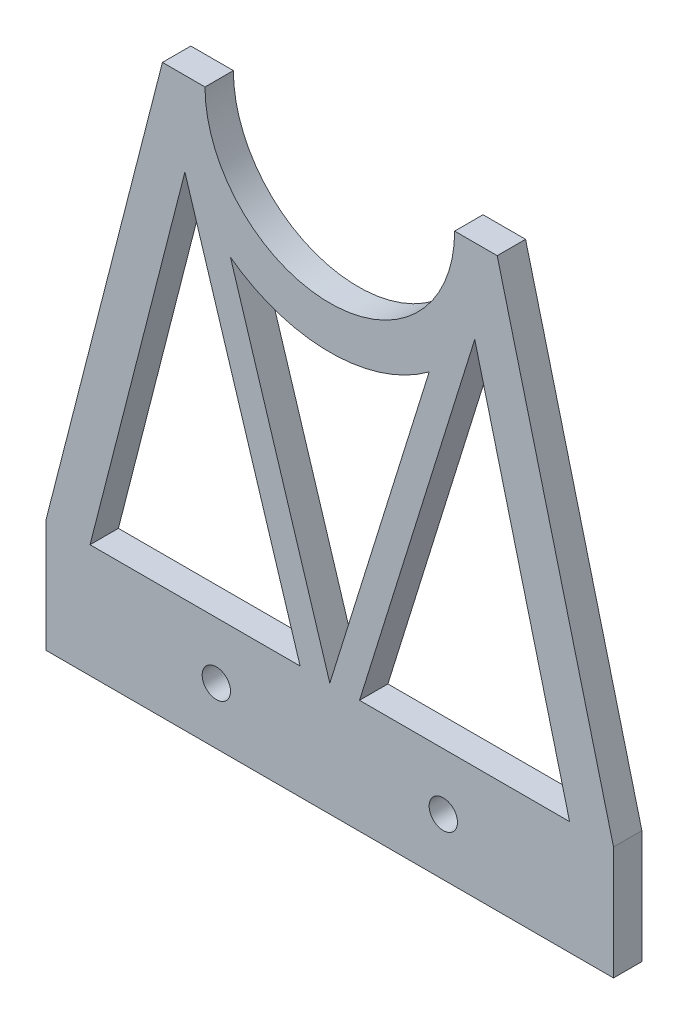
ISO-10303-21;
HEADER;
FILE_DESCRIPTION(('STEP AP214'),'2;1');
FILE_NAME('part.step','',(''),(''),'','','');
FILE_SCHEMA(('AUTOMOTIVE_DESIGN { 1 0 10303 214 1 1 1 1 }'));
ENDSEC;
DATA;
#1=APPLICATION_CONTEXT('core data for automotive mechanical design processes');
#2=APPLICATION_PROTOCOL_DEFINITION('international standard','automotive_design',2000,#1);
#3=PRODUCT_CONTEXT('',#1,'mechanical');
#4=PRODUCT('Part','Part','',(#3));
#5=PRODUCT_RELATED_PRODUCT_CATEGORY('part','',(#4));
#6=PRODUCT_DEFINITION_FORMATION('','',#4);
#7=PRODUCT_DEFINITION_CONTEXT('part definition',#1,'design');
#8=PRODUCT_DEFINITION('design','',#6,#7);
#9=PRODUCT_DEFINITION_SHAPE('','',#8);
#10=(LENGTH_UNIT() NAMED_UNIT(*) SI_UNIT(.MILLI.,.METRE.));
#11=(NAMED_UNIT(*) PLANE_ANGLE_UNIT() SI_UNIT($,.RADIAN.));
#12=(NAMED_UNIT(*) SI_UNIT($,.STERADIAN.) SOLID_ANGLE_UNIT());
#13=UNCERTAINTY_MEASURE_WITH_UNIT(LENGTH_MEASURE(1.E-05),#10,'distance_accuracy_value','');
#14=(GEOMETRIC_REPRESENTATION_CONTEXT(3) GLOBAL_UNCERTAINTY_ASSIGNED_CONTEXT((#13)) GLOBAL_UNIT_ASSIGNED_CONTEXT((#10,
#11,#12)) REPRESENTATION_CONTEXT('',''));
#15=CARTESIAN_POINT('',(0.,0.,0.));
#16=DIRECTION('',(0.,0.,1.));
#17=DIRECTION('',(1.,0.,0.));
#18=AXIS2_PLACEMENT_3D('',#15,#16,#17);
#19=CARTESIAN_POINT('',(0.,70.104,6.35));
#20=DIRECTION('',(0.,0.,1.));
#21=DIRECTION('',(1.,0.,0.));
#22=AXIS2_PLACEMENT_3D('',#19,#20,#21);
#23=PLANE('',#22);
#24=CARTESIAN_POINT('',(25.4,-44.196,6.35));
#25=DIRECTION('',(0.,0.,1.));
#26=DIRECTION('',(1.,0.,0.));
#27=AXIS2_PLACEMENT_3D('',#24,#25,#26);
#28=CIRCLE('',#27,3.175);
#29=CARTESIAN_POINT('',(28.575,-44.196,6.35));
#30=VERTEX_POINT('',#29);
#31=EDGE_CURVE('E291',#30,#30,#28,.T.);
#32=ORIENTED_EDGE('',*,*,#31,.F.);
#33=EDGE_LOOP('',(#32));
#34=FACE_BOUND('',#33,.T.);
#35=CARTESIAN_POINT('',(-25.4,-44.196,6.35));
#36=DIRECTION('',(0.,0.,1.));
#37=DIRECTION('',(1.,0.,0.));
#38=AXIS2_PLACEMENT_3D('',#35,#36,#37);
#39=CIRCLE('',#38,3.175);
#40=CARTESIAN_POINT('',(-22.225,-44.196,6.35));
#41=VERTEX_POINT('',#40);
#42=EDGE_CURVE('E284',#41,#41,#39,.T.);
#43=ORIENTED_EDGE('',*,*,#42,.F.);
#44=EDGE_LOOP('',(#43));
#45=FACE_BOUND('',#44,.T.);
#46=DIRECTION('',(-0.248229683721849,-0.968701204768194,0.));
#47=VECTOR('',#46,1.);
#48=CARTESIAN_POINT('',(-37.465,70.104,6.35));
#49=LINE('',#48,#47);
#50=CARTESIAN_POINT('',(-37.465,70.104,6.35));
#51=VERTEX_POINT('',#50);
#52=CARTESIAN_POINT('',(-63.5,-31.496,6.35));
#53=VERTEX_POINT('',#52);
#54=EDGE_CURVE('E231',#51,#53,#49,.T.);
#55=ORIENTED_EDGE('',*,*,#54,.T.);
#56=DIRECTION('',(0.,-1.,0.));
#57=VECTOR('',#56,1.);
#58=CARTESIAN_POINT('',(-63.5,-31.496,6.35));
#59=LINE('',#58,#57);
#60=CARTESIAN_POINT('',(-63.5,-56.896,6.35));
#61=VERTEX_POINT('',#60);
#62=EDGE_CURVE('E234',#53,#61,#59,.T.);
#63=ORIENTED_EDGE('',*,*,#62,.T.);
#64=DIRECTION('',(1.,0.,0.));
#65=VECTOR('',#64,1.);
#66=CARTESIAN_POINT('',(-63.5,-56.896,6.35));
#67=LINE('',#66,#65);
#68=CARTESIAN_POINT('',(63.5,-56.896,6.35));
#69=VERTEX_POINT('',#68);
#70=EDGE_CURVE('E237',#61,#69,#67,.T.);
#71=ORIENTED_EDGE('',*,*,#70,.T.);
#72=DIRECTION('',(0.,1.,0.));
#73=VECTOR('',#72,1.);
#74=CARTESIAN_POINT('',(63.5,-56.896,6.35));
#75=LINE('',#74,#73);
#76=CARTESIAN_POINT('',(63.5,-31.496,6.35));
#77=VERTEX_POINT('',#76);
#78=EDGE_CURVE('E239',#69,#77,#75,.T.);
#79=ORIENTED_EDGE('',*,*,#78,.T.);
#80=DIRECTION('',(-0.24822968372185,0.968701204768194,0.));
#81=VECTOR('',#80,1.);
#82=CARTESIAN_POINT('',(37.465,70.104,6.35));
#83=LINE('',#82,#81);
#84=CARTESIAN_POINT('',(37.465,70.104,6.35));
#85=VERTEX_POINT('',#84);
#86=EDGE_CURVE('E241',#77,#85,#83,.T.);
#87=ORIENTED_EDGE('',*,*,#86,.T.);
#88=DIRECTION('',(-1.,0.,0.));
#89=VECTOR('',#88,1.);
#90=CARTESIAN_POINT('',(27.94,70.104,6.35));
#91=LINE('',#90,#89);
#92=CARTESIAN_POINT('',(27.94,70.104,6.35));
#93=VERTEX_POINT('',#92);
#94=EDGE_CURVE('E243',#85,#93,#91,.T.);
#95=ORIENTED_EDGE('',*,*,#94,.T.);
#96=CARTESIAN_POINT('',(0.,70.104,6.35));
#97=DIRECTION('',(0.,0.,-1.));
#98=DIRECTION('',(1.,0.,0.));
#99=AXIS2_PLACEMENT_3D('',#96,#97,#98);
#100=CIRCLE('',#99,27.94);
#101=CARTESIAN_POINT('',(-27.94,70.104,6.35));
#102=VERTEX_POINT('',#101);
#103=EDGE_CURVE('E245',#93,#102,#100,.T.);
#104=ORIENTED_EDGE('',*,*,#103,.T.);
#105=DIRECTION('',(-1.,0.,0.));
#106=VECTOR('',#105,1.);
#107=CARTESIAN_POINT('',(-27.94,70.104,6.35));
#108=LINE('',#107,#106);
#109=EDGE_CURVE('E247',#102,#51,#108,.T.);
#110=ORIENTED_EDGE('',*,*,#109,.T.);
#111=EDGE_LOOP('',(#55,#63,#71,#79,#87,#95,#104,#110));
#112=FACE_BOUND('',#111,.T.);
#113=DIRECTION('',(-0.297171473717237,0.954824127894098,0.));
#114=VECTOR('',#113,1.);
#115=CARTESIAN_POINT('',(-6.65043939977215,-31.496,6.35));
#116=LINE('',#115,#114);
#117=CARTESIAN_POINT('',(-6.65043939977215,-31.496,6.35));
#118=VERTEX_POINT('',#117);
#119=CARTESIAN_POINT('',(-32.4365034398139,51.3556808860383,6.35));
#120=VERTEX_POINT('',#119);
#121=EDGE_CURVE('E209',#118,#120,#116,.T.);
#122=ORIENTED_EDGE('',*,*,#121,.F.);
#123=DIRECTION('',(1.,0.,0.));
#124=VECTOR('',#123,1.);
#125=CARTESIAN_POINT('',(-6.65043939977215,-31.496,6.35));
#126=LINE('',#125,#124);
#127=CARTESIAN_POINT('',(-53.6672466668612,-31.496,6.35));
#128=VERTEX_POINT('',#127);
#129=EDGE_CURVE('E207',#128,#118,#126,.T.);
#130=ORIENTED_EDGE('',*,*,#129,.F.);
#131=DIRECTION('',(-0.248229683721849,-0.968701204768194,0.));
#132=VECTOR('',#131,1.);
#133=CARTESIAN_POINT('',(-32.4365034398139,51.3556808860383,6.35));
#134=LINE('',#133,#132);
#135=EDGE_CURVE('E213',#120,#128,#134,.T.);
#136=ORIENTED_EDGE('',*,*,#135,.F.);
#137=EDGE_LOOP('',(#122,#130,#136));
#138=FACE_BOUND('',#137,.T.);
#139=DIRECTION('',(-0.297171473717237,-0.954824127894098,0.));
#140=VECTOR('',#139,1.);
#141=CARTESIAN_POINT('',(28.2999816297775,38.064866729559,6.35));
#142=LINE('',#141,#140);
#143=CARTESIAN_POINT('',(32.4365034398139,51.3556808860383,6.35));
#144=VERTEX_POINT('',#143);
#145=CARTESIAN_POINT('',(6.65043939977216,-31.496,6.35));
#146=VERTEX_POINT('',#145);
#147=EDGE_CURVE('E185',#144,#146,#142,.T.);
#148=ORIENTED_EDGE('',*,*,#147,.F.);
#149=DIRECTION('',(-0.24822968372185,0.968701204768194,0.));
#150=VECTOR('',#149,1.);
#151=CARTESIAN_POINT('',(32.4365034398139,51.3556808860383,6.35));
#152=LINE('',#151,#150);
#153=CARTESIAN_POINT('',(53.6672466668612,-31.496,6.35));
#154=VERTEX_POINT('',#153);
#155=EDGE_CURVE('E183',#154,#144,#152,.T.);
#156=ORIENTED_EDGE('',*,*,#155,.F.);
#157=DIRECTION('',(1.,0.,0.));
#158=VECTOR('',#157,1.);
#159=CARTESIAN_POINT('',(53.6672466668612,-31.496,6.35));
#160=LINE('',#159,#158);
#161=EDGE_CURVE('E189',#146,#154,#160,.T.);
#162=ORIENTED_EDGE('',*,*,#161,.F.);
#163=EDGE_LOOP('',(#148,#156,#162));
#164=FACE_BOUND('',#163,.T.);
#165=DIRECTION('',(0.297171473717237,-0.954824127894098,0.));
#166=VECTOR('',#165,1.);
#167=CARTESIAN_POINT('',(0.,-31.496,6.35));
#168=LINE('',#167,#166);
#169=CARTESIAN_POINT('',(-22.23684841765,39.9519055876634,6.35));
#170=VERTEX_POINT('',#169);
#171=CARTESIAN_POINT('',(0.,-31.496,6.35));
#172=VERTEX_POINT('',#171);
#173=EDGE_CURVE('E162',#170,#172,#168,.T.);
#174=ORIENTED_EDGE('',*,*,#173,.F.);
#175=CARTESIAN_POINT('',(0.,70.104,6.35));
#176=DIRECTION('',(0.,0.,-1.));
#177=DIRECTION('',(1.,0.,0.));
#178=AXIS2_PLACEMENT_3D('',#175,#176,#177);
#179=CIRCLE('',#178,37.465);
#180=CARTESIAN_POINT('',(22.23684841765,39.9519055876634,6.35));
#181=VERTEX_POINT('',#180);
#182=EDGE_CURVE('E154',#181,#170,#179,.T.);
#183=ORIENTED_EDGE('',*,*,#182,.F.);
#184=DIRECTION('',(0.297171473717237,0.954824127894098,0.));
#185=VECTOR('',#184,1.);
#186=CARTESIAN_POINT('',(0.,-31.496,6.35));
#187=LINE('',#186,#185);
#188=EDGE_CURVE('E171',#172,#181,#187,.T.);
#189=ORIENTED_EDGE('',*,*,#188,.F.);
#190=EDGE_LOOP('',(#174,#183,#189));
#191=FACE_BOUND('',#190,.T.);
#192=ADVANCED_FACE('F33',(#34,#45,#112,#138,#164,#191),#23,.T.);
#193=CARTESIAN_POINT('',(0.,70.104,0.));
#194=DIRECTION('',(0.,0.,1.));
#195=DIRECTION('',(1.,0.,0.));
#196=AXIS2_PLACEMENT_3D('',#193,#194,#195);
#197=PLANE('',#196);
#198=CARTESIAN_POINT('',(25.4,-44.196,0.));
#199=DIRECTION('',(0.,0.,1.));
#200=DIRECTION('',(1.,0.,0.));
#201=AXIS2_PLACEMENT_3D('',#198,#199,#200);
#202=CIRCLE('',#201,3.175);
#203=CARTESIAN_POINT('',(28.575,-44.196,0.));
#204=VERTEX_POINT('',#203);
#205=EDGE_CURVE('E37',#204,#204,#202,.T.);
#206=ORIENTED_EDGE('',*,*,#205,.T.);
#207=EDGE_LOOP('',(#206));
#208=FACE_BOUND('',#207,.T.);
#209=CARTESIAN_POINT('',(-25.4,-44.196,0.));
#210=DIRECTION('',(0.,0.,1.));
#211=DIRECTION('',(1.,0.,0.));
#212=AXIS2_PLACEMENT_3D('',#209,#210,#211);
#213=CIRCLE('',#212,3.175);
#214=CARTESIAN_POINT('',(-22.225,-44.196,0.));
#215=VERTEX_POINT('',#214);
#216=EDGE_CURVE('E177',#215,#215,#213,.T.);
#217=ORIENTED_EDGE('',*,*,#216,.T.);
#218=EDGE_LOOP('',(#217));
#219=FACE_BOUND('',#218,.T.);
#220=DIRECTION('',(-0.24822968372185,0.968701204768194,0.));
#221=VECTOR('',#220,1.);
#222=CARTESIAN_POINT('',(32.4365034398139,51.3556808860383,0.));
#223=LINE('',#222,#221);
#224=CARTESIAN_POINT('',(53.6672466668612,-31.496,0.));
#225=VERTEX_POINT('',#224);
#226=CARTESIAN_POINT('',(32.4365034398139,51.3556808860383,0.));
#227=VERTEX_POINT('',#226);
#228=EDGE_CURVE('E169',#225,#227,#223,.T.);
#229=ORIENTED_EDGE('',*,*,#228,.T.);
#230=DIRECTION('',(-0.297171473717237,-0.954824127894099,0.));
#231=VECTOR('',#230,1.);
#232=CARTESIAN_POINT('',(6.65043939977216,-31.496,0.));
#233=LINE('',#232,#231);
#234=CARTESIAN_POINT('',(6.65043939977216,-31.496,0.));
#235=VERTEX_POINT('',#234);
#236=EDGE_CURVE('E194',#227,#235,#233,.T.);
#237=ORIENTED_EDGE('',*,*,#236,.T.);
#238=DIRECTION('',(1.,0.,0.));
#239=VECTOR('',#238,1.);
#240=CARTESIAN_POINT('',(53.6672466668612,-31.496,0.));
#241=LINE('',#240,#239);
#242=EDGE_CURVE('E186',#235,#225,#241,.T.);
#243=ORIENTED_EDGE('',*,*,#242,.T.);
#244=EDGE_LOOP('',(#229,#237,#243));
#245=FACE_BOUND('',#244,.T.);
#246=DIRECTION('',(-0.248229683721849,-0.968701204768194,0.));
#247=VECTOR('',#246,1.);
#248=CARTESIAN_POINT('',(-37.465,70.104,0.));
#249=LINE('',#248,#247);
#250=CARTESIAN_POINT('',(-37.465,70.104,0.));
#251=VERTEX_POINT('',#250);
#252=CARTESIAN_POINT('',(-63.5,-31.496,0.));
#253=VERTEX_POINT('',#252);
#254=EDGE_CURVE('E230',#251,#253,#249,.T.);
#255=ORIENTED_EDGE('',*,*,#254,.F.);
#256=DIRECTION('',(-1.,0.,0.));
#257=VECTOR('',#256,1.);
#258=CARTESIAN_POINT('',(-27.94,70.104,0.));
#259=LINE('',#258,#257);
#260=CARTESIAN_POINT('',(-27.94,70.104,0.));
#261=VERTEX_POINT('',#260);
#262=EDGE_CURVE('E235',#261,#251,#259,.T.);
#263=ORIENTED_EDGE('',*,*,#262,.F.);
#264=CARTESIAN_POINT('',(0.,70.104,0.));
#265=DIRECTION('',(0.,0.,-1.));
#266=DIRECTION('',(1.,0.,0.));
#267=AXIS2_PLACEMENT_3D('',#264,#265,#266);
#268=CIRCLE('',#267,27.94);
#269=CARTESIAN_POINT('',(27.94,70.104,0.));
#270=VERTEX_POINT('',#269);
#271=EDGE_CURVE('E262',#270,#261,#268,.T.);
#272=ORIENTED_EDGE('',*,*,#271,.F.);
#273=DIRECTION('',(-1.,0.,0.));
#274=VECTOR('',#273,1.);
#275=CARTESIAN_POINT('',(27.94,70.104,0.));
#276=LINE('',#275,#274);
#277=CARTESIAN_POINT('',(37.465,70.104,0.));
#278=VERTEX_POINT('',#277);
#279=EDGE_CURVE('E260',#278,#270,#276,.T.);
#280=ORIENTED_EDGE('',*,*,#279,.F.);
#281=DIRECTION('',(-0.24822968372185,0.968701204768194,0.));
#282=VECTOR('',#281,1.);
#283=CARTESIAN_POINT('',(37.465,70.104,0.));
#284=LINE('',#283,#282);
#285=CARTESIAN_POINT('',(63.5,-31.496,0.));
#286=VERTEX_POINT('',#285);
#287=EDGE_CURVE('E258',#286,#278,#284,.T.);
#288=ORIENTED_EDGE('',*,*,#287,.F.);
#289=DIRECTION('',(0.,1.,0.));
#290=VECTOR('',#289,1.);
#291=CARTESIAN_POINT('',(63.5,-56.896,0.));
#292=LINE('',#291,#290);
#293=CARTESIAN_POINT('',(63.5,-56.896,0.));
#294=VERTEX_POINT('',#293);
#295=EDGE_CURVE('E256',#294,#286,#292,.T.);
#296=ORIENTED_EDGE('',*,*,#295,.F.);
#297=DIRECTION('',(1.,0.,0.));
#298=VECTOR('',#297,1.);
#299=CARTESIAN_POINT('',(-63.5,-56.896,0.));
#300=LINE('',#299,#298);
#301=CARTESIAN_POINT('',(-63.5,-56.896,0.));
#302=VERTEX_POINT('',#301);
#303=EDGE_CURVE('E254',#302,#294,#300,.T.);
#304=ORIENTED_EDGE('',*,*,#303,.F.);
#305=DIRECTION('',(0.,-1.,0.));
#306=VECTOR('',#305,1.);
#307=CARTESIAN_POINT('',(-63.5,-31.496,0.));
#308=LINE('',#307,#306);
#309=EDGE_CURVE('E252',#253,#302,#308,.T.);
#310=ORIENTED_EDGE('',*,*,#309,.F.);
#311=EDGE_LOOP('',(#255,#263,#272,#280,#288,#296,#304,#310));
#312=FACE_BOUND('',#311,.T.);
#313=DIRECTION('',(1.,0.,0.));
#314=VECTOR('',#313,1.);
#315=CARTESIAN_POINT('',(-6.65043939977215,-31.496,0.));
#316=LINE('',#315,#314);
#317=CARTESIAN_POINT('',(-53.6672466668612,-31.496,0.));
#318=VERTEX_POINT('',#317);
#319=CARTESIAN_POINT('',(-6.65043939977215,-31.496,0.));
#320=VERTEX_POINT('',#319);
#321=EDGE_CURVE('E206',#318,#320,#316,.T.);
#322=ORIENTED_EDGE('',*,*,#321,.T.);
#323=DIRECTION('',(-0.29717147371724,0.954824127894097,0.));
#324=VECTOR('',#323,1.);
#325=CARTESIAN_POINT('',(-28.2999816297775,38.064866729559,0.));
#326=LINE('',#325,#324);
#327=CARTESIAN_POINT('',(-32.4365034398139,51.3556808860383,0.));
#328=VERTEX_POINT('',#327);
#329=EDGE_CURVE('E218',#320,#328,#326,.T.);
#330=ORIENTED_EDGE('',*,*,#329,.T.);
#331=DIRECTION('',(-0.248229683721849,-0.968701204768194,0.));
#332=VECTOR('',#331,1.);
#333=CARTESIAN_POINT('',(-32.4365034398139,51.3556808860383,0.));
#334=LINE('',#333,#332);
#335=EDGE_CURVE('E210',#328,#318,#334,.T.);
#336=ORIENTED_EDGE('',*,*,#335,.T.);
#337=EDGE_LOOP('',(#322,#330,#336));
#338=FACE_BOUND('',#337,.T.);
#339=CARTESIAN_POINT('',(0.,70.104,0.));
#340=DIRECTION('',(0.,0.,-1.));
#341=DIRECTION('',(1.,0.,0.));
#342=AXIS2_PLACEMENT_3D('',#339,#340,#341);
#343=CIRCLE('',#342,37.465);
#344=CARTESIAN_POINT('',(22.23684841765,39.9519055876634,0.));
#345=VERTEX_POINT('',#344);
#346=CARTESIAN_POINT('',(-22.23684841765,39.9519055876634,0.));
#347=VERTEX_POINT('',#346);
#348=EDGE_CURVE('E58',#345,#347,#343,.T.);
#349=ORIENTED_EDGE('',*,*,#348,.T.);
#350=DIRECTION('',(0.297171473717237,-0.954824127894098,0.));
#351=VECTOR('',#350,1.);
#352=CARTESIAN_POINT('',(0.,-31.496,0.));
#353=LINE('',#352,#351);
#354=CARTESIAN_POINT('',(0.,-31.496,0.));
#355=VERTEX_POINT('',#354);
#356=EDGE_CURVE('E168',#347,#355,#353,.T.);
#357=ORIENTED_EDGE('',*,*,#356,.T.);
#358=DIRECTION('',(0.297171473717237,0.954824127894098,0.));
#359=VECTOR('',#358,1.);
#360=CARTESIAN_POINT('',(0.,-31.496,0.));
#361=LINE('',#360,#359);
#362=EDGE_CURVE('E163',#355,#345,#361,.T.);
#363=ORIENTED_EDGE('',*,*,#362,.T.);
#364=EDGE_LOOP('',(#349,#357,#363));
#365=FACE_BOUND('',#364,.T.);
#366=ADVANCED_FACE('F301',(#208,#219,#245,#312,#338,#365),#197,.F.);
#367=CARTESIAN_POINT('',(-37.465,70.104,6.35));
#368=DIRECTION('',(0.968701204768194,-0.248229683721849,0.));
#369=DIRECTION('',(0.248229683721849,0.968701204768194,0.));
#370=AXIS2_PLACEMENT_3D('',#367,#368,#369);
#371=PLANE('',#370);
#372=ORIENTED_EDGE('',*,*,#254,.T.);
#373=DIRECTION('',(0.,0.,-1.));
#374=VECTOR('',#373,1.);
#375=CARTESIAN_POINT('',(-63.5,-31.496,6.35));
#376=LINE('',#375,#374);
#377=EDGE_CURVE('E11',#53,#253,#376,.T.);
#378=ORIENTED_EDGE('',*,*,#377,.F.);
#379=ORIENTED_EDGE('',*,*,#54,.F.);
#380=DIRECTION('',(0.,0.,-1.));
#381=VECTOR('',#380,1.);
#382=CARTESIAN_POINT('',(-37.465,70.104,6.35));
#383=LINE('',#382,#381);
#384=EDGE_CURVE('E249',#51,#251,#383,.T.);
#385=ORIENTED_EDGE('',*,*,#384,.T.);
#386=EDGE_LOOP('',(#372,#378,#379,#385));
#387=FACE_BOUND('',#386,.T.);
#388=ADVANCED_FACE('F35',(#387),#371,.F.);
#389=CARTESIAN_POINT('',(-63.5,-31.496,6.35));
#390=DIRECTION('',(1.,0.,0.));
#391=DIRECTION('',(0.,0.,-1.));
#392=AXIS2_PLACEMENT_3D('',#389,#390,#391);
#393=PLANE('',#392);
#394=ORIENTED_EDGE('',*,*,#309,.T.);
#395=DIRECTION('',(0.,0.,-1.));
#396=VECTOR('',#395,1.);
#397=CARTESIAN_POINT('',(-63.5,-56.896,6.35));
#398=LINE('',#397,#396);
#399=EDGE_CURVE('E42',#61,#302,#398,.T.);
#400=ORIENTED_EDGE('',*,*,#399,.F.);
#401=ORIENTED_EDGE('',*,*,#62,.F.);
#402=ORIENTED_EDGE('',*,*,#377,.T.);
#403=EDGE_LOOP('',(#394,#400,#401,#402));
#404=FACE_BOUND('',#403,.T.);
#405=ADVANCED_FACE('F374',(#404),#393,.F.);
#406=CARTESIAN_POINT('',(-63.5,-56.896,6.35));
#407=DIRECTION('',(0.,1.,0.));
#408=DIRECTION('',(0.,0.,1.));
#409=AXIS2_PLACEMENT_3D('',#406,#407,#408);
#410=PLANE('',#409);
#411=ORIENTED_EDGE('',*,*,#303,.T.);
#412=DIRECTION('',(0.,0.,-1.));
#413=VECTOR('',#412,1.);
#414=CARTESIAN_POINT('',(63.5,-56.896,6.35));
#415=LINE('',#414,#413);
#416=EDGE_CURVE('E279',#69,#294,#415,.T.);
#417=ORIENTED_EDGE('',*,*,#416,.F.);
#418=ORIENTED_EDGE('',*,*,#70,.F.);
#419=ORIENTED_EDGE('',*,*,#399,.T.);
#420=EDGE_LOOP('',(#411,#417,#418,#419));
#421=FACE_BOUND('',#420,.T.);
#422=ADVANCED_FACE('F371',(#421),#410,.F.);
#423=CARTESIAN_POINT('',(63.5,-56.896,6.35));
#424=DIRECTION('',(-1.,0.,0.));
#425=DIRECTION('',(0.,0.,1.));
#426=AXIS2_PLACEMENT_3D('',#423,#424,#425);
#427=PLANE('',#426);
#428=ORIENTED_EDGE('',*,*,#295,.T.);
#429=DIRECTION('',(0.,0.,-1.));
#430=VECTOR('',#429,1.);
#431=CARTESIAN_POINT('',(63.5,-31.496,6.35));
#432=LINE('',#431,#430);
#433=EDGE_CURVE('E276',#77,#286,#432,.T.);
#434=ORIENTED_EDGE('',*,*,#433,.F.);
#435=ORIENTED_EDGE('',*,*,#78,.F.);
#436=ORIENTED_EDGE('',*,*,#416,.T.);
#437=EDGE_LOOP('',(#428,#434,#435,#436));
#438=FACE_BOUND('',#437,.T.);
#439=ADVANCED_FACE('F367',(#438),#427,.F.);
#440=CARTESIAN_POINT('',(37.465,70.104,6.35));
#441=DIRECTION('',(-0.968701204768194,-0.24822968372185,0.));
#442=DIRECTION('',(0.24822968372185,-0.968701204768194,0.));
#443=AXIS2_PLACEMENT_3D('',#440,#441,#442);
#444=PLANE('',#443);
#445=ORIENTED_EDGE('',*,*,#287,.T.);
#446=DIRECTION('',(0.,0.,-1.));
#447=VECTOR('',#446,1.);
#448=CARTESIAN_POINT('',(37.465,70.104,6.35));
#449=LINE('',#448,#447);
#450=EDGE_CURVE('E273',#85,#278,#449,.T.);
#451=ORIENTED_EDGE('',*,*,#450,.F.);
#452=ORIENTED_EDGE('',*,*,#86,.F.);
#453=ORIENTED_EDGE('',*,*,#433,.T.);
#454=EDGE_LOOP('',(#445,#451,#452,#453));
#455=FACE_BOUND('',#454,.T.);
#456=ADVANCED_FACE('F363',(#455),#444,.F.);
#457=CARTESIAN_POINT('',(27.94,70.104,6.35));
#458=DIRECTION('',(0.,-1.,0.));
#459=DIRECTION('',(1.,0.,0.));
#460=AXIS2_PLACEMENT_3D('',#457,#458,#459);
#461=PLANE('',#460);
#462=ORIENTED_EDGE('',*,*,#279,.T.);
#463=DIRECTION('',(0.,0.,-1.));
#464=VECTOR('',#463,1.);
#465=CARTESIAN_POINT('',(27.94,70.104,6.35));
#466=LINE('',#465,#464);
#467=EDGE_CURVE('E270',#93,#270,#466,.T.);
#468=ORIENTED_EDGE('',*,*,#467,.F.);
#469=ORIENTED_EDGE('',*,*,#94,.F.);
#470=ORIENTED_EDGE('',*,*,#450,.T.);
#471=EDGE_LOOP('',(#462,#468,#469,#470));
#472=FACE_BOUND('',#471,.T.);
#473=ADVANCED_FACE('F359',(#472),#461,.F.);
#474=CARTESIAN_POINT('',(0.,70.104,6.35));
#475=DIRECTION('',(0.,0.,-1.));
#476=DIRECTION('',(-1.,0.,0.));
#477=AXIS2_PLACEMENT_3D('',#474,#475,#476);
#478=CYLINDRICAL_SURFACE('',#477,27.94);
#479=ORIENTED_EDGE('',*,*,#271,.T.);
#480=DIRECTION('',(0.,0.,-1.));
#481=VECTOR('',#480,1.);
#482=CARTESIAN_POINT('',(-27.94,70.104,6.35));
#483=LINE('',#482,#481);
#484=EDGE_CURVE('E267',#102,#261,#483,.T.);
#485=ORIENTED_EDGE('',*,*,#484,.F.);
#486=ORIENTED_EDGE('',*,*,#103,.F.);
#487=ORIENTED_EDGE('',*,*,#467,.T.);
#488=EDGE_LOOP('',(#479,#485,#486,#487));
#489=FACE_BOUND('',#488,.T.);
#490=ADVANCED_FACE('F355',(#489),#478,.F.);
#491=CARTESIAN_POINT('',(-27.94,70.104,6.35));
#492=DIRECTION('',(0.,-1.,0.));
#493=DIRECTION('',(0.,0.,-1.));
#494=AXIS2_PLACEMENT_3D('',#491,#492,#493);
#495=PLANE('',#494);
#496=ORIENTED_EDGE('',*,*,#262,.T.);
#497=ORIENTED_EDGE('',*,*,#384,.F.);
#498=ORIENTED_EDGE('',*,*,#109,.F.);
#499=ORIENTED_EDGE('',*,*,#484,.T.);
#500=EDGE_LOOP('',(#496,#497,#498,#499));
#501=FACE_BOUND('',#500,.T.);
#502=ADVANCED_FACE('F347',(#501),#495,.F.);
#503=CARTESIAN_POINT('',(-6.65043939977215,-31.496,6.35));
#504=DIRECTION('',(0.,1.,0.));
#505=DIRECTION('',(-1.,0.,0.));
#506=AXIS2_PLACEMENT_3D('',#503,#504,#505);
#507=PLANE('',#506);
#508=ORIENTED_EDGE('',*,*,#321,.F.);
#509=DIRECTION('',(0.,0.,-1.));
#510=VECTOR('',#509,1.);
#511=CARTESIAN_POINT('',(-53.6672466668612,-31.496,6.35));
#512=LINE('',#511,#510);
#513=EDGE_CURVE('E215',#128,#318,#512,.T.);
#514=ORIENTED_EDGE('',*,*,#513,.F.);
#515=ORIENTED_EDGE('',*,*,#129,.T.);
#516=DIRECTION('',(0.,0.,-1.));
#517=VECTOR('',#516,1.);
#518=CARTESIAN_POINT('',(-6.65043939977215,-31.496,6.35));
#519=LINE('',#518,#517);
#520=EDGE_CURVE('E227',#118,#320,#519,.T.);
#521=ORIENTED_EDGE('',*,*,#520,.T.);
#522=EDGE_LOOP('',(#508,#514,#515,#521));
#523=FACE_BOUND('',#522,.T.);
#524=ADVANCED_FACE('F344',(#523),#507,.T.);
#525=CARTESIAN_POINT('',(-28.2999816297775,38.064866729559,6.35));
#526=DIRECTION('',(-0.954824127894097,-0.29717147371724,0.));
#527=DIRECTION('',(0.29717147371724,-0.954824127894097,0.));
#528=AXIS2_PLACEMENT_3D('',#525,#526,#527);
#529=PLANE('',#528);
#530=ORIENTED_EDGE('',*,*,#329,.F.);
#531=ORIENTED_EDGE('',*,*,#520,.F.);
#532=ORIENTED_EDGE('',*,*,#121,.T.);
#533=DIRECTION('',(0.,0.,-1.));
#534=VECTOR('',#533,1.);
#535=CARTESIAN_POINT('',(-32.4365034398139,51.3556808860383,6.35));
#536=LINE('',#535,#534);
#537=EDGE_CURVE('E225',#120,#328,#536,.T.);
#538=ORIENTED_EDGE('',*,*,#537,.T.);
#539=EDGE_LOOP('',(#530,#531,#532,#538));
#540=FACE_BOUND('',#539,.T.);
#541=ADVANCED_FACE('F340',(#540),#529,.T.);
#542=CARTESIAN_POINT('',(-32.4365034398139,51.3556808860383,6.35));
#543=DIRECTION('',(0.968701204768194,-0.248229683721849,0.));
#544=DIRECTION('',(0.248229683721849,0.968701204768194,0.));
#545=AXIS2_PLACEMENT_3D('',#542,#543,#544);
#546=PLANE('',#545);
#547=ORIENTED_EDGE('',*,*,#335,.F.);
#548=ORIENTED_EDGE('',*,*,#537,.F.);
#549=ORIENTED_EDGE('',*,*,#135,.T.);
#550=ORIENTED_EDGE('',*,*,#513,.T.);
#551=EDGE_LOOP('',(#547,#548,#549,#550));
#552=FACE_BOUND('',#551,.T.);
#553=ADVANCED_FACE('F337',(#552),#546,.T.);
#554=CARTESIAN_POINT('',(32.4365034398139,51.3556808860383,6.35));
#555=DIRECTION('',(-0.968701204768194,-0.24822968372185,0.));
#556=DIRECTION('',(0.24822968372185,-0.968701204768194,0.));
#557=AXIS2_PLACEMENT_3D('',#554,#555,#556);
#558=PLANE('',#557);
#559=ORIENTED_EDGE('',*,*,#228,.F.);
#560=DIRECTION('',(0.,0.,-1.));
#561=VECTOR('',#560,1.);
#562=CARTESIAN_POINT('',(53.6672466668612,-31.496,6.35));
#563=LINE('',#562,#561);
#564=EDGE_CURVE('E191',#154,#225,#563,.T.);
#565=ORIENTED_EDGE('',*,*,#564,.F.);
#566=ORIENTED_EDGE('',*,*,#155,.T.);
#567=DIRECTION('',(0.,0.,-1.));
#568=VECTOR('',#567,1.);
#569=CARTESIAN_POINT('',(32.4365034398139,51.3556808860383,6.35));
#570=LINE('',#569,#568);
#571=EDGE_CURVE('E203',#144,#227,#570,.T.);
#572=ORIENTED_EDGE('',*,*,#571,.T.);
#573=EDGE_LOOP('',(#559,#565,#566,#572));
#574=FACE_BOUND('',#573,.T.);
#575=ADVANCED_FACE('F319',(#574),#558,.T.);
#576=CARTESIAN_POINT('',(6.65043939977216,-31.496,6.35));
#577=DIRECTION('',(0.954824127894098,-0.297171473717237,0.));
#578=DIRECTION('',(0.297171473717237,0.954824127894099,0.));
#579=AXIS2_PLACEMENT_3D('',#576,#577,#578);
#580=PLANE('',#579);
#581=ORIENTED_EDGE('',*,*,#236,.F.);
#582=ORIENTED_EDGE('',*,*,#571,.F.);
#583=ORIENTED_EDGE('',*,*,#147,.T.);
#584=DIRECTION('',(0.,0.,-1.));
#585=VECTOR('',#584,1.);
#586=CARTESIAN_POINT('',(6.65043939977216,-31.496,6.35));
#587=LINE('',#586,#585);
#588=EDGE_CURVE('E201',#146,#235,#587,.T.);
#589=ORIENTED_EDGE('',*,*,#588,.T.);
#590=EDGE_LOOP('',(#581,#582,#583,#589));
#591=FACE_BOUND('',#590,.T.);
#592=ADVANCED_FACE('F316',(#591),#580,.T.);
#593=CARTESIAN_POINT('',(53.6672466668612,-31.496,6.35));
#594=DIRECTION('',(0.,1.,0.));
#595=DIRECTION('',(-1.,0.,0.));
#596=AXIS2_PLACEMENT_3D('',#593,#594,#595);
#597=PLANE('',#596);
#598=ORIENTED_EDGE('',*,*,#242,.F.);
#599=ORIENTED_EDGE('',*,*,#588,.F.);
#600=ORIENTED_EDGE('',*,*,#161,.T.);
#601=ORIENTED_EDGE('',*,*,#564,.T.);
#602=EDGE_LOOP('',(#598,#599,#600,#601));
#603=FACE_BOUND('',#602,.T.);
#604=ADVANCED_FACE('F324',(#603),#597,.T.);
#605=CARTESIAN_POINT('',(0.,70.104,6.35));
#606=DIRECTION('',(0.,0.,-1.));
#607=DIRECTION('',(-1.,0.,0.));
#608=AXIS2_PLACEMENT_3D('',#605,#606,#607);
#609=CYLINDRICAL_SURFACE('',#608,37.465);
#610=ORIENTED_EDGE('',*,*,#348,.F.);
#611=DIRECTION('',(0.,0.,-1.));
#612=VECTOR('',#611,1.);
#613=CARTESIAN_POINT('',(22.23684841765,39.9519055876634,6.35));
#614=LINE('',#613,#612);
#615=EDGE_CURVE('E158',#181,#345,#614,.T.);
#616=ORIENTED_EDGE('',*,*,#615,.F.);
#617=ORIENTED_EDGE('',*,*,#182,.T.);
#618=DIRECTION('',(0.,0.,-1.));
#619=VECTOR('',#618,1.);
#620=CARTESIAN_POINT('',(-22.23684841765,39.9519055876634,6.35));
#621=LINE('',#620,#619);
#622=EDGE_CURVE('E157',#170,#347,#621,.T.);
#623=ORIENTED_EDGE('',*,*,#622,.T.);
#624=EDGE_LOOP('',(#610,#616,#617,#623));
#625=FACE_BOUND('',#624,.T.);
#626=ADVANCED_FACE('F156',(#625),#609,.T.);
#627=CARTESIAN_POINT('',(0.,-31.496,6.35));
#628=DIRECTION('',(0.954824127894098,0.297171473717237,0.));
#629=DIRECTION('',(-0.297171473717237,0.954824127894098,0.));
#630=AXIS2_PLACEMENT_3D('',#627,#628,#629);
#631=PLANE('',#630);
#632=ORIENTED_EDGE('',*,*,#356,.F.);
#633=ORIENTED_EDGE('',*,*,#622,.F.);
#634=ORIENTED_EDGE('',*,*,#173,.T.);
#635=DIRECTION('',(0.,0.,-1.));
#636=VECTOR('',#635,1.);
#637=CARTESIAN_POINT('',(0.,-31.496,6.35));
#638=LINE('',#637,#636);
#639=EDGE_CURVE('E50',#172,#355,#638,.T.);
#640=ORIENTED_EDGE('',*,*,#639,.T.);
#641=EDGE_LOOP('',(#632,#633,#634,#640));
#642=FACE_BOUND('',#641,.T.);
#643=ADVANCED_FACE('F166',(#642),#631,.T.);
#644=CARTESIAN_POINT('',(0.,-31.496,6.35));
#645=DIRECTION('',(-0.954824127894098,0.297171473717237,0.));
#646=DIRECTION('',(-0.297171473717237,-0.954824127894098,0.));
#647=AXIS2_PLACEMENT_3D('',#644,#645,#646);
#648=PLANE('',#647);
#649=ORIENTED_EDGE('',*,*,#362,.F.);
#650=ORIENTED_EDGE('',*,*,#639,.F.);
#651=ORIENTED_EDGE('',*,*,#188,.T.);
#652=ORIENTED_EDGE('',*,*,#615,.T.);
#653=EDGE_LOOP('',(#649,#650,#651,#652));
#654=FACE_BOUND('',#653,.T.);
#655=ADVANCED_FACE('F404',(#654),#648,.T.);
#656=CARTESIAN_POINT('',(-25.4,-44.196,-12.065));
#657=DIRECTION('',(0.,0.,1.));
#658=DIRECTION('',(1.,0.,0.));
#659=AXIS2_PLACEMENT_3D('',#656,#657,#658);
#660=CYLINDRICAL_SURFACE('',#659,3.175);
#661=ORIENTED_EDGE('',*,*,#42,.T.);
#662=EDGE_LOOP('',(#661));
#663=FACE_BOUND('',#662,.T.);
#664=ORIENTED_EDGE('',*,*,#216,.F.);
#665=EDGE_LOOP('',(#664));
#666=FACE_BOUND('',#665,.T.);
#667=ADVANCED_FACE('F406',(#663,#666),#660,.F.);
#668=CARTESIAN_POINT('',(25.4,-44.196,-12.065));
#669=DIRECTION('',(0.,0.,1.));
#670=DIRECTION('',(1.,0.,0.));
#671=AXIS2_PLACEMENT_3D('',#668,#669,#670);
#672=CYLINDRICAL_SURFACE('',#671,3.175);
#673=ORIENTED_EDGE('',*,*,#31,.T.);
#674=EDGE_LOOP('',(#673));
#675=FACE_BOUND('',#674,.T.);
#676=ORIENTED_EDGE('',*,*,#205,.F.);
#677=EDGE_LOOP('',(#676));
#678=FACE_BOUND('',#677,.T.);
#679=ADVANCED_FACE('F296',(#675,#678),#672,.F.);
#680=CLOSED_SHELL('',(#192,#366,#388,#405,#422,#439,#456,#473,#490,#502,#524,#541,#553,#575,
#592,#604,#626,#643,#655,#667,#679));
#681=MANIFOLD_SOLID_BREP('B2',#680);
#682=ADVANCED_BREP_SHAPE_REPRESENTATION('',(#18,#681),#14);
#683=SHAPE_DEFINITION_REPRESENTATION(#9,#682);
ENDSEC;
END-ISO-10303-21;
